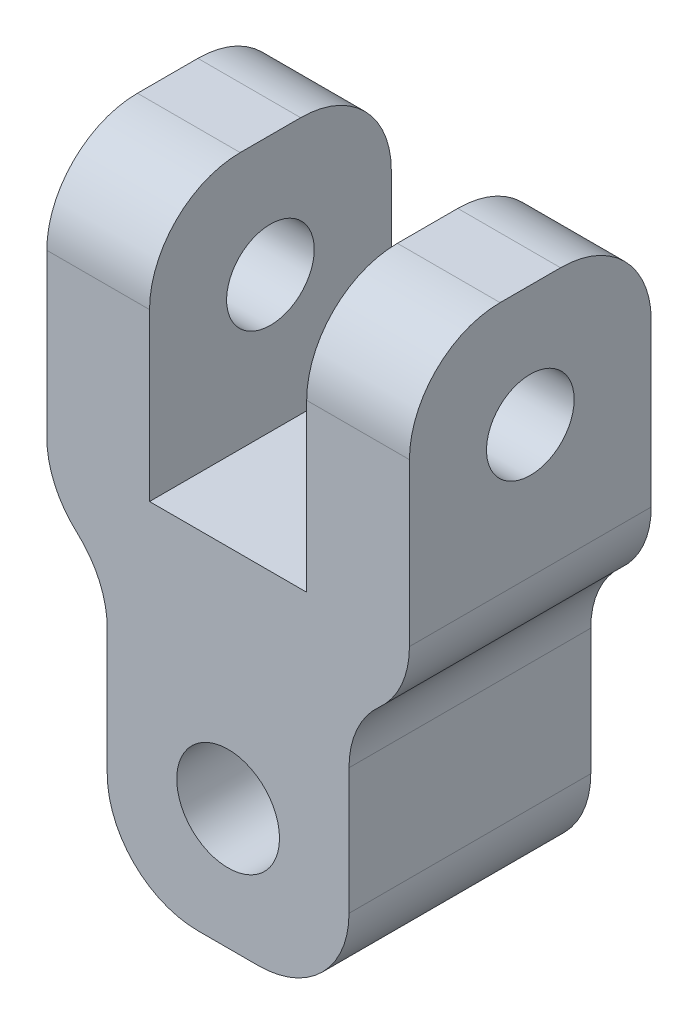
ISO-10303-21;
HEADER;
FILE_DESCRIPTION(('STEP AP214'),'2;1');
FILE_NAME('part.step','',(''),(''),'','','');
FILE_SCHEMA(('AUTOMOTIVE_DESIGN { 1 0 10303 214 1 1 1 1 }'));
ENDSEC;
DATA;
#1=APPLICATION_CONTEXT('core data for automotive mechanical design processes');
#2=APPLICATION_PROTOCOL_DEFINITION('international standard','automotive_design',2000,#1);
#3=PRODUCT_CONTEXT('',#1,'mechanical');
#4=PRODUCT('Part','Part','',(#3));
#5=PRODUCT_RELATED_PRODUCT_CATEGORY('part','',(#4));
#6=PRODUCT_DEFINITION_FORMATION('','',#4);
#7=PRODUCT_DEFINITION_CONTEXT('part definition',#1,'design');
#8=PRODUCT_DEFINITION('design','',#6,#7);
#9=PRODUCT_DEFINITION_SHAPE('','',#8);
#10=(LENGTH_UNIT() NAMED_UNIT(*) SI_UNIT(.MILLI.,.METRE.));
#11=(NAMED_UNIT(*) PLANE_ANGLE_UNIT() SI_UNIT($,.RADIAN.));
#12=(NAMED_UNIT(*) SI_UNIT($,.STERADIAN.) SOLID_ANGLE_UNIT());
#13=UNCERTAINTY_MEASURE_WITH_UNIT(LENGTH_MEASURE(1.E-05),#10,'distance_accuracy_value','');
#14=(GEOMETRIC_REPRESENTATION_CONTEXT(3) GLOBAL_UNCERTAINTY_ASSIGNED_CONTEXT((#13)) GLOBAL_UNIT_ASSIGNED_CONTEXT((#10,
#11,#12)) REPRESENTATION_CONTEXT('',''));
#15=CARTESIAN_POINT('',(0.,0.,0.));
#16=DIRECTION('',(0.,0.,1.));
#17=DIRECTION('',(1.,0.,0.));
#18=AXIS2_PLACEMENT_3D('',#15,#16,#17);
#19=CARTESIAN_POINT('',(0.,20.,0.));
#20=DIRECTION('',(0.,1.,0.));
#21=DIRECTION('',(0.,0.,1.));
#22=AXIS2_PLACEMENT_3D('',#19,#20,#21);
#23=PLANE('',#22);
#24=DIRECTION('',(0.,0.,1.));
#25=VECTOR('',#24,1.);
#26=CARTESIAN_POINT('',(1.4,20.,0.));
#27=LINE('',#26,#25);
#28=CARTESIAN_POINT('',(1.4,20.,3.));
#29=VERTEX_POINT('',#28);
#30=CARTESIAN_POINT('',(1.4,20.,5.));
#31=VERTEX_POINT('',#30);
#32=EDGE_CURVE('E207',#29,#31,#27,.T.);
#33=ORIENTED_EDGE('',*,*,#32,.F.);
#34=DIRECTION('',(-1.,0.,0.));
#35=VECTOR('',#34,1.);
#36=CARTESIAN_POINT('',(-2.,20.,3.));
#37=LINE('',#36,#35);
#38=CARTESIAN_POINT('',(-2.,20.,3.));
#39=VERTEX_POINT('',#38);
#40=EDGE_CURVE('E327',#29,#39,#37,.T.);
#41=ORIENTED_EDGE('',*,*,#40,.T.);
#42=DIRECTION('',(0.,0.,1.));
#43=VECTOR('',#42,1.);
#44=CARTESIAN_POINT('',(-2.,20.,0.));
#45=LINE('',#44,#43);
#46=CARTESIAN_POINT('',(-2.,20.,5.));
#47=VERTEX_POINT('',#46);
#48=EDGE_CURVE('E220',#39,#47,#45,.T.);
#49=ORIENTED_EDGE('',*,*,#48,.T.);
#50=DIRECTION('',(1.,0.,0.));
#51=VECTOR('',#50,1.);
#52=CARTESIAN_POINT('',(1.4,20.,5.));
#53=LINE('',#52,#51);
#54=EDGE_CURVE('E324',#47,#31,#53,.T.);
#55=ORIENTED_EDGE('',*,*,#54,.T.);
#56=EDGE_LOOP('',(#33,#41,#49,#55));
#57=FACE_BOUND('',#56,.T.);
#58=ADVANCED_FACE('F33',(#57),#23,.T.);
#59=CARTESIAN_POINT('',(0.,20.,0.));
#60=DIRECTION('',(1.,0.,0.));
#61=DIRECTION('',(0.,0.,-1.));
#62=AXIS2_PLACEMENT_3D('',#59,#60,#61);
#63=PLANE('',#62);
#64=DIRECTION('',(0.,-1.,0.));
#65=VECTOR('',#64,1.);
#66=CARTESIAN_POINT('',(0.,20.,0.));
#67=LINE('',#66,#65);
#68=CARTESIAN_POINT('',(0.,7.17157287525381,0.));
#69=VERTEX_POINT('',#68);
#70=CARTESIAN_POINT('',(0.,3.,0.));
#71=VERTEX_POINT('',#70);
#72=EDGE_CURVE('E241',#69,#71,#67,.T.);
#73=ORIENTED_EDGE('',*,*,#72,.T.);
#74=DIRECTION('',(0.,0.,1.));
#75=VECTOR('',#74,1.);
#76=CARTESIAN_POINT('',(0.,3.,0.));
#77=LINE('',#76,#75);
#78=CARTESIAN_POINT('',(0.,3.,8.));
#79=VERTEX_POINT('',#78);
#80=EDGE_CURVE('E269',#71,#79,#77,.T.);
#81=ORIENTED_EDGE('',*,*,#80,.T.);
#82=DIRECTION('',(0.,-1.,0.));
#83=VECTOR('',#82,1.);
#84=CARTESIAN_POINT('',(0.,20.,8.));
#85=LINE('',#84,#83);
#86=CARTESIAN_POINT('',(0.,7.17157287525381,8.));
#87=VERTEX_POINT('',#86);
#88=EDGE_CURVE('E250',#87,#79,#85,.T.);
#89=ORIENTED_EDGE('',*,*,#88,.F.);
#90=DIRECTION('',(0.,0.,-1.));
#91=VECTOR('',#90,1.);
#92=CARTESIAN_POINT('',(0.,7.17157287525381,0.));
#93=LINE('',#92,#91);
#94=EDGE_CURVE('E256',#87,#69,#93,.T.);
#95=ORIENTED_EDGE('',*,*,#94,.T.);
#96=EDGE_LOOP('',(#73,#81,#89,#95));
#97=FACE_BOUND('',#96,.T.);
#98=ADVANCED_FACE('F383',(#97),#63,.F.);
#99=CARTESIAN_POINT('',(0.,20.,8.));
#100=DIRECTION('',(0.,0.,-1.));
#101=DIRECTION('',(-1.,0.,0.));
#102=AXIS2_PLACEMENT_3D('',#99,#100,#101);
#103=PLANE('',#102);
#104=CARTESIAN_POINT('',(4.,4.,8.));
#105=DIRECTION('',(0.,0.,1.));
#106=DIRECTION('',(1.,0.,0.));
#107=AXIS2_PLACEMENT_3D('',#104,#105,#106);
#108=CIRCLE('',#107,1.7);
#109=CARTESIAN_POINT('',(5.7,4.,8.));
#110=VERTEX_POINT('',#109);
#111=EDGE_CURVE('E229',#110,#110,#108,.T.);
#112=ORIENTED_EDGE('',*,*,#111,.F.);
#113=EDGE_LOOP('',(#112));
#114=FACE_BOUND('',#113,.T.);
#115=ORIENTED_EDGE('',*,*,#88,.T.);
#116=CARTESIAN_POINT('',(3.,3.,8.));
#117=DIRECTION('',(0.,0.,-1.));
#118=DIRECTION('',(-1.,0.,0.));
#119=AXIS2_PLACEMENT_3D('',#116,#117,#118);
#120=CIRCLE('',#119,3.);
#121=CARTESIAN_POINT('',(3.,0.,8.));
#122=VERTEX_POINT('',#121);
#123=EDGE_CURVE('E286',#79,#122,#120,.F.);
#124=ORIENTED_EDGE('',*,*,#123,.T.);
#125=DIRECTION('',(1.,0.,0.));
#126=VECTOR('',#125,1.);
#127=CARTESIAN_POINT('',(0.,0.,8.));
#128=LINE('',#127,#126);
#129=CARTESIAN_POINT('',(5.,0.,8.));
#130=VERTEX_POINT('',#129);
#131=EDGE_CURVE('E234',#122,#130,#128,.T.);
#132=ORIENTED_EDGE('',*,*,#131,.T.);
#133=CARTESIAN_POINT('',(5.,3.,8.));
#134=DIRECTION('',(0.,0.,-1.));
#135=DIRECTION('',(-1.,0.,0.));
#136=AXIS2_PLACEMENT_3D('',#133,#134,#135);
#137=CIRCLE('',#136,3.);
#138=CARTESIAN_POINT('',(8.,3.,8.));
#139=VERTEX_POINT('',#138);
#140=EDGE_CURVE('E284',#130,#139,#137,.F.);
#141=ORIENTED_EDGE('',*,*,#140,.T.);
#142=DIRECTION('',(0.,-1.,0.));
#143=VECTOR('',#142,1.);
#144=CARTESIAN_POINT('',(8.,20.,8.));
#145=LINE('',#144,#143);
#146=CARTESIAN_POINT('',(8.,7.17157287525381,8.));
#147=VERTEX_POINT('',#146);
#148=EDGE_CURVE('E247',#147,#139,#145,.T.);
#149=ORIENTED_EDGE('',*,*,#148,.F.);
#150=CARTESIAN_POINT('',(11.,7.17157287525381,8.));
#151=DIRECTION('',(0.,0.,-1.));
#152=DIRECTION('',(-1.,0.,0.));
#153=AXIS2_PLACEMENT_3D('',#150,#151,#152);
#154=CIRCLE('',#153,3.);
#155=CARTESIAN_POINT('',(9.,9.4076408527536,8.));
#156=VERTEX_POINT('',#155);
#157=EDGE_CURVE('E259',#147,#156,#154,.T.);
#158=ORIENTED_EDGE('',*,*,#157,.T.);
#159=CARTESIAN_POINT('',(7.,11.6437088302534,8.));
#160=DIRECTION('',(0.,0.,-1.));
#161=DIRECTION('',(-1.,0.,0.));
#162=AXIS2_PLACEMENT_3D('',#159,#160,#161);
#163=CIRCLE('',#162,3.);
#164=CARTESIAN_POINT('',(10.,11.6437088302534,8.));
#165=VERTEX_POINT('',#164);
#166=EDGE_CURVE('E280',#156,#165,#163,.F.);
#167=ORIENTED_EDGE('',*,*,#166,.T.);
#168=DIRECTION('',(0.,1.,0.));
#169=VECTOR('',#168,1.);
#170=CARTESIAN_POINT('',(10.,10.,8.));
#171=LINE('',#170,#169);
#172=CARTESIAN_POINT('',(10.,17.,8.));
#173=VERTEX_POINT('',#172);
#174=EDGE_CURVE('E216',#165,#173,#171,.T.);
#175=ORIENTED_EDGE('',*,*,#174,.T.);
#176=DIRECTION('',(1.,0.,0.));
#177=VECTOR('',#176,1.);
#178=CARTESIAN_POINT('',(6.6,17.,8.));
#179=LINE('',#178,#177);
#180=CARTESIAN_POINT('',(6.6,17.,8.));
#181=VERTEX_POINT('',#180);
#182=EDGE_CURVE('E276',#173,#181,#179,.F.);
#183=ORIENTED_EDGE('',*,*,#182,.T.);
#184=DIRECTION('',(0.,1.,0.));
#185=VECTOR('',#184,1.);
#186=CARTESIAN_POINT('',(6.6,20.,8.));
#187=LINE('',#186,#185);
#188=CARTESIAN_POINT('',(6.6,11.5,8.));
#189=VERTEX_POINT('',#188);
#190=EDGE_CURVE('E183',#189,#181,#187,.T.);
#191=ORIENTED_EDGE('',*,*,#190,.F.);
#192=DIRECTION('',(1.,0.,0.));
#193=VECTOR('',#192,1.);
#194=CARTESIAN_POINT('',(1.4,11.5,8.));
#195=LINE('',#194,#193);
#196=CARTESIAN_POINT('',(1.4,11.5,8.));
#197=VERTEX_POINT('',#196);
#198=EDGE_CURVE('E203',#197,#189,#195,.T.);
#199=ORIENTED_EDGE('',*,*,#198,.F.);
#200=DIRECTION('',(0.,-1.,0.));
#201=VECTOR('',#200,1.);
#202=CARTESIAN_POINT('',(1.4,20.,8.));
#203=LINE('',#202,#201);
#204=CARTESIAN_POINT('',(1.4,17.,8.));
#205=VERTEX_POINT('',#204);
#206=EDGE_CURVE('E189',#205,#197,#203,.T.);
#207=ORIENTED_EDGE('',*,*,#206,.F.);
#208=DIRECTION('',(1.,0.,0.));
#209=VECTOR('',#208,1.);
#210=CARTESIAN_POINT('',(-2.,17.,8.));
#211=LINE('',#210,#209);
#212=CARTESIAN_POINT('',(-2.,17.,8.));
#213=VERTEX_POINT('',#212);
#214=EDGE_CURVE('E278',#205,#213,#211,.F.);
#215=ORIENTED_EDGE('',*,*,#214,.T.);
#216=DIRECTION('',(0.,1.,0.));
#217=VECTOR('',#216,1.);
#218=CARTESIAN_POINT('',(-2.,10.,8.));
#219=LINE('',#218,#217);
#220=CARTESIAN_POINT('',(-2.,11.6437088302534,8.));
#221=VERTEX_POINT('',#220);
#222=EDGE_CURVE('E226',#221,#213,#219,.T.);
#223=ORIENTED_EDGE('',*,*,#222,.F.);
#224=CARTESIAN_POINT('',(1.,11.6437088302534,8.));
#225=DIRECTION('',(0.,0.,-1.));
#226=DIRECTION('',(-1.,0.,0.));
#227=AXIS2_PLACEMENT_3D('',#224,#225,#226);
#228=CIRCLE('',#227,3.);
#229=CARTESIAN_POINT('',(-0.999999999999999,9.4076408527536,8.));
#230=VERTEX_POINT('',#229);
#231=EDGE_CURVE('E282',#221,#230,#228,.F.);
#232=ORIENTED_EDGE('',*,*,#231,.T.);
#233=CARTESIAN_POINT('',(-3.,7.17157287525381,8.));
#234=DIRECTION('',(0.,0.,-1.));
#235=DIRECTION('',(-1.,0.,0.));
#236=AXIS2_PLACEMENT_3D('',#233,#234,#235);
#237=CIRCLE('',#236,3.);
#238=EDGE_CURVE('E267',#230,#87,#237,.T.);
#239=ORIENTED_EDGE('',*,*,#238,.T.);
#240=EDGE_LOOP('',(#115,#124,#132,#141,#149,#158,#167,#175,#183,#191,#199,#207,#215,#223,#232,#239));
#241=FACE_BOUND('',#240,.T.);
#242=ADVANCED_FACE('F353',(#114,#241),#103,.F.);
#243=CARTESIAN_POINT('',(8.,20.,0.));
#244=DIRECTION('',(-1.,0.,0.));
#245=DIRECTION('',(0.,0.,1.));
#246=AXIS2_PLACEMENT_3D('',#243,#244,#245);
#247=PLANE('',#246);
#248=ORIENTED_EDGE('',*,*,#148,.T.);
#249=DIRECTION('',(0.,0.,-1.));
#250=VECTOR('',#249,1.);
#251=CARTESIAN_POINT('',(8.,3.,0.));
#252=LINE('',#251,#250);
#253=CARTESIAN_POINT('',(8.,3.,0.));
#254=VERTEX_POINT('',#253);
#255=EDGE_CURVE('E303',#139,#254,#252,.T.);
#256=ORIENTED_EDGE('',*,*,#255,.T.);
#257=DIRECTION('',(0.,-1.,0.));
#258=VECTOR('',#257,1.);
#259=CARTESIAN_POINT('',(8.,20.,0.));
#260=LINE('',#259,#258);
#261=CARTESIAN_POINT('',(8.,7.17157287525381,0.));
#262=VERTEX_POINT('',#261);
#263=EDGE_CURVE('E244',#262,#254,#260,.T.);
#264=ORIENTED_EDGE('',*,*,#263,.F.);
#265=DIRECTION('',(0.,0.,-1.));
#266=VECTOR('',#265,1.);
#267=CARTESIAN_POINT('',(8.,7.17157287525381,0.));
#268=LINE('',#267,#266);
#269=EDGE_CURVE('E253',#262,#147,#268,.F.);
#270=ORIENTED_EDGE('',*,*,#269,.T.);
#271=EDGE_LOOP('',(#248,#256,#264,#270));
#272=FACE_BOUND('',#271,.T.);
#273=ADVANCED_FACE('F366',(#272),#247,.F.);
#274=CARTESIAN_POINT('',(0.,20.,0.));
#275=DIRECTION('',(0.,0.,1.));
#276=DIRECTION('',(1.,0.,0.));
#277=AXIS2_PLACEMENT_3D('',#274,#275,#276);
#278=PLANE('',#277);
#279=DIRECTION('',(-1.,0.,0.));
#280=VECTOR('',#279,1.);
#281=CARTESIAN_POINT('',(0.,0.,0.));
#282=LINE('',#281,#280);
#283=CARTESIAN_POINT('',(5.,0.,0.));
#284=VERTEX_POINT('',#283);
#285=CARTESIAN_POINT('',(3.,0.,0.));
#286=VERTEX_POINT('',#285);
#287=EDGE_CURVE('E239',#284,#286,#282,.T.);
#288=ORIENTED_EDGE('',*,*,#287,.T.);
#289=CARTESIAN_POINT('',(3.,3.,0.));
#290=DIRECTION('',(0.,0.,1.));
#291=DIRECTION('',(1.,0.,0.));
#292=AXIS2_PLACEMENT_3D('',#289,#290,#291);
#293=CIRCLE('',#292,3.);
#294=EDGE_CURVE('E301',#286,#71,#293,.F.);
#295=ORIENTED_EDGE('',*,*,#294,.T.);
#296=ORIENTED_EDGE('',*,*,#72,.F.);
#297=CARTESIAN_POINT('',(-3.,7.17157287525381,0.));
#298=DIRECTION('',(0.,0.,1.));
#299=DIRECTION('',(1.,0.,0.));
#300=AXIS2_PLACEMENT_3D('',#297,#298,#299);
#301=CIRCLE('',#300,3.);
#302=CARTESIAN_POINT('',(-0.999999999999997,9.4076408527536,0.));
#303=VERTEX_POINT('',#302);
#304=EDGE_CURVE('E264',#69,#303,#301,.T.);
#305=ORIENTED_EDGE('',*,*,#304,.T.);
#306=CARTESIAN_POINT('',(1.,11.6437088302534,0.));
#307=DIRECTION('',(0.,0.,1.));
#308=DIRECTION('',(1.,0.,0.));
#309=AXIS2_PLACEMENT_3D('',#306,#307,#308);
#310=CIRCLE('',#309,3.);
#311=CARTESIAN_POINT('',(-2.,11.6437088302534,0.));
#312=VERTEX_POINT('',#311);
#313=EDGE_CURVE('E297',#303,#312,#310,.F.);
#314=ORIENTED_EDGE('',*,*,#313,.T.);
#315=DIRECTION('',(0.,1.,0.));
#316=VECTOR('',#315,1.);
#317=CARTESIAN_POINT('',(-2.,10.,0.));
#318=LINE('',#317,#316);
#319=CARTESIAN_POINT('',(-2.,17.,0.));
#320=VERTEX_POINT('',#319);
#321=EDGE_CURVE('E225',#312,#320,#318,.T.);
#322=ORIENTED_EDGE('',*,*,#321,.T.);
#323=DIRECTION('',(-1.,0.,0.));
#324=VECTOR('',#323,1.);
#325=CARTESIAN_POINT('',(1.4,17.,0.));
#326=LINE('',#325,#324);
#327=CARTESIAN_POINT('',(1.4,17.,0.));
#328=VERTEX_POINT('',#327);
#329=EDGE_CURVE('E180',#320,#328,#326,.F.);
#330=ORIENTED_EDGE('',*,*,#329,.T.);
#331=DIRECTION('',(0.,-1.,0.));
#332=VECTOR('',#331,1.);
#333=CARTESIAN_POINT('',(1.4,20.,0.));
#334=LINE('',#333,#332);
#335=CARTESIAN_POINT('',(1.4,11.5,0.));
#336=VERTEX_POINT('',#335);
#337=EDGE_CURVE('E170',#328,#336,#334,.T.);
#338=ORIENTED_EDGE('',*,*,#337,.T.);
#339=DIRECTION('',(1.,0.,0.));
#340=VECTOR('',#339,1.);
#341=CARTESIAN_POINT('',(1.4,11.5,0.));
#342=LINE('',#341,#340);
#343=CARTESIAN_POINT('',(6.6,11.5,0.));
#344=VERTEX_POINT('',#343);
#345=EDGE_CURVE('E177',#336,#344,#342,.T.);
#346=ORIENTED_EDGE('',*,*,#345,.T.);
#347=DIRECTION('',(0.,1.,0.));
#348=VECTOR('',#347,1.);
#349=CARTESIAN_POINT('',(6.6,20.,0.));
#350=LINE('',#349,#348);
#351=CARTESIAN_POINT('',(6.6,17.,0.));
#352=VERTEX_POINT('',#351);
#353=EDGE_CURVE('E194',#344,#352,#350,.T.);
#354=ORIENTED_EDGE('',*,*,#353,.T.);
#355=DIRECTION('',(-1.,0.,0.));
#356=VECTOR('',#355,1.);
#357=CARTESIAN_POINT('',(10.,17.,0.));
#358=LINE('',#357,#356);
#359=CARTESIAN_POINT('',(10.,17.,0.));
#360=VERTEX_POINT('',#359);
#361=EDGE_CURVE('E292',#352,#360,#358,.F.);
#362=ORIENTED_EDGE('',*,*,#361,.T.);
#363=DIRECTION('',(0.,1.,0.));
#364=VECTOR('',#363,1.);
#365=CARTESIAN_POINT('',(10.,10.,0.));
#366=LINE('',#365,#364);
#367=CARTESIAN_POINT('',(10.,11.6437088302534,0.));
#368=VERTEX_POINT('',#367);
#369=EDGE_CURVE('E217',#368,#360,#366,.T.);
#370=ORIENTED_EDGE('',*,*,#369,.F.);
#371=CARTESIAN_POINT('',(7.,11.6437088302534,0.));
#372=DIRECTION('',(0.,0.,1.));
#373=DIRECTION('',(1.,0.,0.));
#374=AXIS2_PLACEMENT_3D('',#371,#372,#373);
#375=CIRCLE('',#374,3.);
#376=CARTESIAN_POINT('',(9.,9.4076408527536,0.));
#377=VERTEX_POINT('',#376);
#378=EDGE_CURVE('E295',#368,#377,#375,.F.);
#379=ORIENTED_EDGE('',*,*,#378,.T.);
#380=CARTESIAN_POINT('',(11.,7.17157287525381,0.));
#381=DIRECTION('',(0.,0.,1.));
#382=DIRECTION('',(1.,0.,0.));
#383=AXIS2_PLACEMENT_3D('',#380,#381,#382);
#384=CIRCLE('',#383,3.);
#385=EDGE_CURVE('E262',#377,#262,#384,.T.);
#386=ORIENTED_EDGE('',*,*,#385,.T.);
#387=ORIENTED_EDGE('',*,*,#263,.T.);
#388=CARTESIAN_POINT('',(5.,3.,0.));
#389=DIRECTION('',(0.,0.,1.));
#390=DIRECTION('',(1.,0.,0.));
#391=AXIS2_PLACEMENT_3D('',#388,#389,#390);
#392=CIRCLE('',#391,3.);
#393=EDGE_CURVE('E299',#254,#284,#392,.F.);
#394=ORIENTED_EDGE('',*,*,#393,.T.);
#395=EDGE_LOOP('',(#288,#295,#296,#305,#314,#322,#330,#338,#346,#354,#362,#370,#379,#386,#387,#394));
#396=FACE_BOUND('',#395,.T.);
#397=CARTESIAN_POINT('',(4.,4.,0.));
#398=DIRECTION('',(0.,0.,1.));
#399=DIRECTION('',(1.,0.,0.));
#400=AXIS2_PLACEMENT_3D('',#397,#398,#399);
#401=CIRCLE('',#400,1.7);
#402=CARTESIAN_POINT('',(5.7,4.,0.));
#403=VERTEX_POINT('',#402);
#404=EDGE_CURVE('E231',#403,#403,#401,.T.);
#405=ORIENTED_EDGE('',*,*,#404,.T.);
#406=EDGE_LOOP('',(#405));
#407=FACE_BOUND('',#406,.T.);
#408=ADVANCED_FACE('F173',(#396,#407),#278,.F.);
#409=DIRECTION('',(0.,0.,1.));
#410=VECTOR('',#409,1.);
#411=CARTESIAN_POINT('',(6.6,20.,0.));
#412=LINE('',#411,#410);
#413=CARTESIAN_POINT('',(6.6,20.,3.));
#414=VERTEX_POINT('',#413);
#415=CARTESIAN_POINT('',(6.6,20.,5.));
#416=VERTEX_POINT('',#415);
#417=EDGE_CURVE('E211',#414,#416,#412,.T.);
#418=ORIENTED_EDGE('',*,*,#417,.T.);
#419=DIRECTION('',(1.,0.,0.));
#420=VECTOR('',#419,1.);
#421=CARTESIAN_POINT('',(10.,20.,5.));
#422=LINE('',#421,#420);
#423=CARTESIAN_POINT('',(10.,20.,5.));
#424=VERTEX_POINT('',#423);
#425=EDGE_CURVE('E336',#416,#424,#422,.T.);
#426=ORIENTED_EDGE('',*,*,#425,.T.);
#427=DIRECTION('',(0.,0.,-1.));
#428=VECTOR('',#427,1.);
#429=CARTESIAN_POINT('',(10.,20.,0.));
#430=LINE('',#429,#428);
#431=CARTESIAN_POINT('',(10.,20.,3.));
#432=VERTEX_POINT('',#431);
#433=EDGE_CURVE('E210',#424,#432,#430,.T.);
#434=ORIENTED_EDGE('',*,*,#433,.T.);
#435=DIRECTION('',(-1.,0.,0.));
#436=VECTOR('',#435,1.);
#437=CARTESIAN_POINT('',(6.6,20.,3.));
#438=LINE('',#437,#436);
#439=EDGE_CURVE('E334',#432,#414,#438,.T.);
#440=ORIENTED_EDGE('',*,*,#439,.T.);
#441=EDGE_LOOP('',(#418,#426,#434,#440));
#442=FACE_BOUND('',#441,.T.);
#443=ADVANCED_FACE('F346',(#442),#23,.T.);
#444=CARTESIAN_POINT('',(0.,0.,0.));
#445=DIRECTION('',(0.,1.,0.));
#446=DIRECTION('',(0.,0.,1.));
#447=AXIS2_PLACEMENT_3D('',#444,#445,#446);
#448=PLANE('',#447);
#449=ORIENTED_EDGE('',*,*,#131,.F.);
#450=DIRECTION('',(0.,0.,1.));
#451=VECTOR('',#450,1.);
#452=CARTESIAN_POINT('',(3.,0.,0.));
#453=LINE('',#452,#451);
#454=EDGE_CURVE('E290',#122,#286,#453,.F.);
#455=ORIENTED_EDGE('',*,*,#454,.T.);
#456=ORIENTED_EDGE('',*,*,#287,.F.);
#457=DIRECTION('',(0.,0.,-1.));
#458=VECTOR('',#457,1.);
#459=CARTESIAN_POINT('',(5.,0.,0.));
#460=LINE('',#459,#458);
#461=EDGE_CURVE('E288',#284,#130,#460,.F.);
#462=ORIENTED_EDGE('',*,*,#461,.T.);
#463=EDGE_LOOP('',(#449,#455,#456,#462));
#464=FACE_BOUND('',#463,.T.);
#465=ADVANCED_FACE('F376',(#464),#448,.F.);
#466=CARTESIAN_POINT('',(4.,4.,0.));
#467=DIRECTION('',(0.,0.,1.));
#468=DIRECTION('',(1.,0.,0.));
#469=AXIS2_PLACEMENT_3D('',#466,#467,#468);
#470=CYLINDRICAL_SURFACE('',#469,1.7);
#471=ORIENTED_EDGE('',*,*,#404,.F.);
#472=EDGE_LOOP('',(#471));
#473=FACE_BOUND('',#472,.T.);
#474=ORIENTED_EDGE('',*,*,#111,.T.);
#475=EDGE_LOOP('',(#474));
#476=FACE_BOUND('',#475,.T.);
#477=ADVANCED_FACE('F430',(#473,#476),#470,.F.);
#478=CARTESIAN_POINT('',(-2.,10.,0.));
#479=DIRECTION('',(-1.,0.,0.));
#480=DIRECTION('',(0.,0.,1.));
#481=AXIS2_PLACEMENT_3D('',#478,#479,#480);
#482=PLANE('',#481);
#483=CARTESIAN_POINT('',(-2.,16.,4.));
#484=DIRECTION('',(1.,0.,0.));
#485=DIRECTION('',(0.,0.,-1.));
#486=AXIS2_PLACEMENT_3D('',#483,#484,#485);
#487=CIRCLE('',#486,1.45);
#488=CARTESIAN_POINT('',(-2.,16.,2.55));
#489=VERTEX_POINT('',#488);
#490=EDGE_CURVE('E273',#489,#489,#487,.T.);
#491=ORIENTED_EDGE('',*,*,#490,.T.);
#492=EDGE_LOOP('',(#491));
#493=FACE_BOUND('',#492,.T.);
#494=ORIENTED_EDGE('',*,*,#321,.F.);
#495=DIRECTION('',(0.,0.,1.));
#496=VECTOR('',#495,1.);
#497=CARTESIAN_POINT('',(-2.,11.6437088302534,8.));
#498=LINE('',#497,#496);
#499=EDGE_CURVE('E310',#312,#221,#498,.T.);
#500=ORIENTED_EDGE('',*,*,#499,.T.);
#501=ORIENTED_EDGE('',*,*,#222,.T.);
#502=CARTESIAN_POINT('',(-2.,17.,5.));
#503=DIRECTION('',(-1.,0.,0.));
#504=DIRECTION('',(0.,0.,1.));
#505=AXIS2_PLACEMENT_3D('',#502,#503,#504);
#506=CIRCLE('',#505,3.);
#507=EDGE_CURVE('E306',#213,#47,#506,.T.);
#508=ORIENTED_EDGE('',*,*,#507,.T.);
#509=ORIENTED_EDGE('',*,*,#48,.F.);
#510=CARTESIAN_POINT('',(-2.,17.,3.));
#511=DIRECTION('',(-1.,0.,0.));
#512=DIRECTION('',(0.,0.,1.));
#513=AXIS2_PLACEMENT_3D('',#510,#511,#512);
#514=CIRCLE('',#513,3.);
#515=EDGE_CURVE('E308',#39,#320,#514,.T.);
#516=ORIENTED_EDGE('',*,*,#515,.T.);
#517=EDGE_LOOP('',(#494,#500,#501,#508,#509,#516));
#518=FACE_BOUND('',#517,.T.);
#519=ADVANCED_FACE('F397',(#493,#518),#482,.T.);
#520=CARTESIAN_POINT('',(10.,10.,0.));
#521=DIRECTION('',(1.,0.,0.));
#522=DIRECTION('',(0.,0.,-1.));
#523=AXIS2_PLACEMENT_3D('',#520,#521,#522);
#524=PLANE('',#523);
#525=CARTESIAN_POINT('',(10.,16.,4.));
#526=DIRECTION('',(1.,0.,0.));
#527=DIRECTION('',(0.,0.,-1.));
#528=AXIS2_PLACEMENT_3D('',#525,#526,#527);
#529=CIRCLE('',#528,1.45);
#530=CARTESIAN_POINT('',(10.,16.,2.55));
#531=VERTEX_POINT('',#530);
#532=EDGE_CURVE('E637',#531,#531,#529,.T.);
#533=ORIENTED_EDGE('',*,*,#532,.F.);
#534=EDGE_LOOP('',(#533));
#535=FACE_BOUND('',#534,.T.);
#536=ORIENTED_EDGE('',*,*,#174,.F.);
#537=DIRECTION('',(0.,0.,1.));
#538=VECTOR('',#537,1.);
#539=CARTESIAN_POINT('',(10.,11.6437088302534,0.));
#540=LINE('',#539,#538);
#541=EDGE_CURVE('E319',#165,#368,#540,.F.);
#542=ORIENTED_EDGE('',*,*,#541,.T.);
#543=ORIENTED_EDGE('',*,*,#369,.T.);
#544=CARTESIAN_POINT('',(10.,17.,3.));
#545=DIRECTION('',(1.,0.,0.));
#546=DIRECTION('',(0.,0.,-1.));
#547=AXIS2_PLACEMENT_3D('',#544,#545,#546);
#548=CIRCLE('',#547,3.);
#549=EDGE_CURVE('E315',#360,#432,#548,.T.);
#550=ORIENTED_EDGE('',*,*,#549,.T.);
#551=ORIENTED_EDGE('',*,*,#433,.F.);
#552=CARTESIAN_POINT('',(10.,17.,5.));
#553=DIRECTION('',(1.,0.,0.));
#554=DIRECTION('',(0.,0.,-1.));
#555=AXIS2_PLACEMENT_3D('',#552,#553,#554);
#556=CIRCLE('',#555,3.);
#557=EDGE_CURVE('E317',#424,#173,#556,.T.);
#558=ORIENTED_EDGE('',*,*,#557,.T.);
#559=EDGE_LOOP('',(#536,#542,#543,#550,#551,#558));
#560=FACE_BOUND('',#559,.T.);
#561=ADVANCED_FACE('F344',(#535,#560),#524,.T.);
#562=CARTESIAN_POINT('',(1.4,20.,0.));
#563=DIRECTION('',(-1.,0.,0.));
#564=DIRECTION('',(0.,-1.,0.));
#565=AXIS2_PLACEMENT_3D('',#562,#563,#564);
#566=PLANE('',#565);
#567=CARTESIAN_POINT('',(1.4,16.,4.));
#568=DIRECTION('',(-1.,0.,0.));
#569=DIRECTION('',(0.,-1.,0.));
#570=AXIS2_PLACEMENT_3D('',#567,#568,#569);
#571=CIRCLE('',#570,1.45);
#572=CARTESIAN_POINT('',(1.4,14.55,4.));
#573=VERTEX_POINT('',#572);
#574=EDGE_CURVE('E204',#573,#573,#571,.T.);
#575=ORIENTED_EDGE('',*,*,#574,.T.);
#576=EDGE_LOOP('',(#575));
#577=FACE_BOUND('',#576,.T.);
#578=ORIENTED_EDGE('',*,*,#337,.F.);
#579=CARTESIAN_POINT('',(1.4,17.,3.));
#580=DIRECTION('',(-1.,0.,0.));
#581=DIRECTION('',(0.,-1.,0.));
#582=AXIS2_PLACEMENT_3D('',#579,#580,#581);
#583=CIRCLE('',#582,3.);
#584=EDGE_CURVE('E332',#328,#29,#583,.F.);
#585=ORIENTED_EDGE('',*,*,#584,.T.);
#586=ORIENTED_EDGE('',*,*,#32,.T.);
#587=CARTESIAN_POINT('',(1.4,17.,5.));
#588=DIRECTION('',(-1.,0.,0.));
#589=DIRECTION('',(0.,-1.,0.));
#590=AXIS2_PLACEMENT_3D('',#587,#588,#589);
#591=CIRCLE('',#590,3.);
#592=EDGE_CURVE('E330',#31,#205,#591,.F.);
#593=ORIENTED_EDGE('',*,*,#592,.T.);
#594=ORIENTED_EDGE('',*,*,#206,.T.);
#595=DIRECTION('',(0.,0.,1.));
#596=VECTOR('',#595,1.);
#597=CARTESIAN_POINT('',(1.4,11.5,0.));
#598=LINE('',#597,#596);
#599=EDGE_CURVE('E186',#336,#197,#598,.T.);
#600=ORIENTED_EDGE('',*,*,#599,.F.);
#601=EDGE_LOOP('',(#578,#585,#586,#593,#594,#600));
#602=FACE_BOUND('',#601,.T.);
#603=ADVANCED_FACE('F187',(#577,#602),#566,.F.);
#604=CARTESIAN_POINT('',(6.6,20.,0.));
#605=DIRECTION('',(1.,0.,0.));
#606=DIRECTION('',(0.,1.,0.));
#607=AXIS2_PLACEMENT_3D('',#604,#605,#606);
#608=PLANE('',#607);
#609=CARTESIAN_POINT('',(6.6,16.,4.));
#610=DIRECTION('',(1.,0.,0.));
#611=DIRECTION('',(0.,1.,0.));
#612=AXIS2_PLACEMENT_3D('',#609,#610,#611);
#613=CIRCLE('',#612,1.45);
#614=CARTESIAN_POINT('',(6.6,17.45,4.));
#615=VERTEX_POINT('',#614);
#616=EDGE_CURVE('E270',#615,#615,#613,.T.);
#617=ORIENTED_EDGE('',*,*,#616,.T.);
#618=EDGE_LOOP('',(#617));
#619=FACE_BOUND('',#618,.T.);
#620=ORIENTED_EDGE('',*,*,#190,.T.);
#621=CARTESIAN_POINT('',(6.6,17.,5.));
#622=DIRECTION('',(1.,0.,0.));
#623=DIRECTION('',(0.,1.,0.));
#624=AXIS2_PLACEMENT_3D('',#621,#622,#623);
#625=CIRCLE('',#624,3.);
#626=EDGE_CURVE('E11',#181,#416,#625,.F.);
#627=ORIENTED_EDGE('',*,*,#626,.T.);
#628=ORIENTED_EDGE('',*,*,#417,.F.);
#629=CARTESIAN_POINT('',(6.6,17.,3.));
#630=DIRECTION('',(1.,0.,0.));
#631=DIRECTION('',(0.,1.,0.));
#632=AXIS2_PLACEMENT_3D('',#629,#630,#631);
#633=CIRCLE('',#632,3.);
#634=EDGE_CURVE('E41',#414,#352,#633,.F.);
#635=ORIENTED_EDGE('',*,*,#634,.T.);
#636=ORIENTED_EDGE('',*,*,#353,.F.);
#637=DIRECTION('',(0.,0.,1.));
#638=VECTOR('',#637,1.);
#639=CARTESIAN_POINT('',(6.6,11.5,0.));
#640=LINE('',#639,#638);
#641=EDGE_CURVE('E193',#344,#189,#640,.T.);
#642=ORIENTED_EDGE('',*,*,#641,.T.);
#643=EDGE_LOOP('',(#620,#627,#628,#635,#636,#642));
#644=FACE_BOUND('',#643,.T.);
#645=ADVANCED_FACE('F338',(#619,#644),#608,.F.);
#646=CARTESIAN_POINT('',(1.4,11.5,0.));
#647=DIRECTION('',(0.,-1.,0.));
#648=DIRECTION('',(0.,0.,-1.));
#649=AXIS2_PLACEMENT_3D('',#646,#647,#648);
#650=PLANE('',#649);
#651=ORIENTED_EDGE('',*,*,#198,.T.);
#652=ORIENTED_EDGE('',*,*,#641,.F.);
#653=ORIENTED_EDGE('',*,*,#345,.F.);
#654=ORIENTED_EDGE('',*,*,#599,.T.);
#655=EDGE_LOOP('',(#651,#652,#653,#654));
#656=FACE_BOUND('',#655,.T.);
#657=ADVANCED_FACE('F196',(#656),#650,.F.);
#658=CARTESIAN_POINT('',(11.,7.17157287525381,0.));
#659=DIRECTION('',(0.,0.,-1.));
#660=DIRECTION('',(-1.,0.,0.));
#661=AXIS2_PLACEMENT_3D('',#658,#659,#660);
#662=CYLINDRICAL_SURFACE('',#661,3.);
#663=ORIENTED_EDGE('',*,*,#385,.F.);
#664=DIRECTION('',(0.,0.,-1.));
#665=VECTOR('',#664,1.);
#666=CARTESIAN_POINT('',(9.,9.4076408527536,0.));
#667=LINE('',#666,#665);
#668=EDGE_CURVE('E322',#377,#156,#667,.F.);
#669=ORIENTED_EDGE('',*,*,#668,.T.);
#670=ORIENTED_EDGE('',*,*,#157,.F.);
#671=ORIENTED_EDGE('',*,*,#269,.F.);
#672=EDGE_LOOP('',(#663,#669,#670,#671));
#673=FACE_BOUND('',#672,.T.);
#674=ADVANCED_FACE('F364',(#673),#662,.F.);
#675=CARTESIAN_POINT('',(-3.,7.17157287525381,0.));
#676=DIRECTION('',(0.,0.,-1.));
#677=DIRECTION('',(-1.,0.,0.));
#678=AXIS2_PLACEMENT_3D('',#675,#676,#677);
#679=CYLINDRICAL_SURFACE('',#678,3.);
#680=ORIENTED_EDGE('',*,*,#238,.F.);
#681=DIRECTION('',(0.,0.,-1.));
#682=VECTOR('',#681,1.);
#683=CARTESIAN_POINT('',(-0.999999999999998,9.4076408527536,0.));
#684=LINE('',#683,#682);
#685=EDGE_CURVE('E313',#230,#303,#684,.T.);
#686=ORIENTED_EDGE('',*,*,#685,.T.);
#687=ORIENTED_EDGE('',*,*,#304,.F.);
#688=ORIENTED_EDGE('',*,*,#94,.F.);
#689=EDGE_LOOP('',(#680,#686,#687,#688));
#690=FACE_BOUND('',#689,.T.);
#691=ADVANCED_FACE('F388',(#690),#679,.F.);
#692=CARTESIAN_POINT('',(-2.,16.,4.));
#693=DIRECTION('',(1.,0.,0.));
#694=DIRECTION('',(0.,0.,-1.));
#695=AXIS2_PLACEMENT_3D('',#692,#693,#694);
#696=CYLINDRICAL_SURFACE('',#695,1.45);
#697=ORIENTED_EDGE('',*,*,#532,.T.);
#698=EDGE_LOOP('',(#697));
#699=FACE_BOUND('',#698,.T.);
#700=ORIENTED_EDGE('',*,*,#616,.F.);
#701=EDGE_LOOP('',(#700));
#702=FACE_BOUND('',#701,.T.);
#703=ADVANCED_FACE('F444',(#699,#702),#696,.F.);
#704=ORIENTED_EDGE('',*,*,#490,.F.);
#705=EDGE_LOOP('',(#704));
#706=FACE_BOUND('',#705,.T.);
#707=ORIENTED_EDGE('',*,*,#574,.F.);
#708=EDGE_LOOP('',(#707));
#709=FACE_BOUND('',#708,.T.);
#710=ADVANCED_FACE('F447',(#706,#709),#696,.F.);
#711=CARTESIAN_POINT('',(3.,3.,0.));
#712=DIRECTION('',(0.,0.,1.));
#713=DIRECTION('',(1.,0.,0.));
#714=AXIS2_PLACEMENT_3D('',#711,#712,#713);
#715=CYLINDRICAL_SURFACE('',#714,3.);
#716=ORIENTED_EDGE('',*,*,#294,.F.);
#717=ORIENTED_EDGE('',*,*,#454,.F.);
#718=ORIENTED_EDGE('',*,*,#123,.F.);
#719=ORIENTED_EDGE('',*,*,#80,.F.);
#720=EDGE_LOOP('',(#716,#717,#718,#719));
#721=FACE_BOUND('',#720,.T.);
#722=ADVANCED_FACE('F379',(#721),#715,.T.);
#723=CARTESIAN_POINT('',(5.,3.,0.));
#724=DIRECTION('',(0.,0.,-1.));
#725=DIRECTION('',(-1.,0.,0.));
#726=AXIS2_PLACEMENT_3D('',#723,#724,#725);
#727=CYLINDRICAL_SURFACE('',#726,3.);
#728=ORIENTED_EDGE('',*,*,#140,.F.);
#729=ORIENTED_EDGE('',*,*,#461,.F.);
#730=ORIENTED_EDGE('',*,*,#393,.F.);
#731=ORIENTED_EDGE('',*,*,#255,.F.);
#732=EDGE_LOOP('',(#728,#729,#730,#731));
#733=FACE_BOUND('',#732,.T.);
#734=ADVANCED_FACE('F372',(#733),#727,.T.);
#735=CARTESIAN_POINT('',(1.,11.6437088302534,0.));
#736=DIRECTION('',(0.,0.,-1.));
#737=DIRECTION('',(-1.,0.,0.));
#738=AXIS2_PLACEMENT_3D('',#735,#736,#737);
#739=CYLINDRICAL_SURFACE('',#738,3.);
#740=ORIENTED_EDGE('',*,*,#313,.F.);
#741=ORIENTED_EDGE('',*,*,#685,.F.);
#742=ORIENTED_EDGE('',*,*,#231,.F.);
#743=ORIENTED_EDGE('',*,*,#499,.F.);
#744=EDGE_LOOP('',(#740,#741,#742,#743));
#745=FACE_BOUND('',#744,.T.);
#746=ADVANCED_FACE('F394',(#745),#739,.T.);
#747=CARTESIAN_POINT('',(7.,11.6437088302534,0.));
#748=DIRECTION('',(0.,0.,-1.));
#749=DIRECTION('',(-1.,0.,0.));
#750=AXIS2_PLACEMENT_3D('',#747,#748,#749);
#751=CYLINDRICAL_SURFACE('',#750,3.);
#752=ORIENTED_EDGE('',*,*,#166,.F.);
#753=ORIENTED_EDGE('',*,*,#668,.F.);
#754=ORIENTED_EDGE('',*,*,#378,.F.);
#755=ORIENTED_EDGE('',*,*,#541,.F.);
#756=EDGE_LOOP('',(#752,#753,#754,#755));
#757=FACE_BOUND('',#756,.T.);
#758=ADVANCED_FACE('F359',(#757),#751,.T.);
#759=CARTESIAN_POINT('',(0.,17.,3.));
#760=DIRECTION('',(1.,0.,0.));
#761=DIRECTION('',(0.,0.,-1.));
#762=AXIS2_PLACEMENT_3D('',#759,#760,#761);
#763=CYLINDRICAL_SURFACE('',#762,3.);
#764=ORIENTED_EDGE('',*,*,#584,.F.);
#765=ORIENTED_EDGE('',*,*,#329,.F.);
#766=ORIENTED_EDGE('',*,*,#515,.F.);
#767=ORIENTED_EDGE('',*,*,#40,.F.);
#768=EDGE_LOOP('',(#764,#765,#766,#767));
#769=FACE_BOUND('',#768,.T.);
#770=ADVANCED_FACE('F408',(#769),#763,.T.);
#771=CARTESIAN_POINT('',(0.,17.,5.));
#772=DIRECTION('',(-1.,0.,0.));
#773=DIRECTION('',(0.,0.,1.));
#774=AXIS2_PLACEMENT_3D('',#771,#772,#773);
#775=CYLINDRICAL_SURFACE('',#774,3.);
#776=ORIENTED_EDGE('',*,*,#507,.F.);
#777=ORIENTED_EDGE('',*,*,#214,.F.);
#778=ORIENTED_EDGE('',*,*,#592,.F.);
#779=ORIENTED_EDGE('',*,*,#54,.F.);
#780=EDGE_LOOP('',(#776,#777,#778,#779));
#781=FACE_BOUND('',#780,.T.);
#782=ADVANCED_FACE('F401',(#781),#775,.T.);
#783=CARTESIAN_POINT('',(0.,17.,5.));
#784=DIRECTION('',(-1.,0.,0.));
#785=DIRECTION('',(0.,0.,1.));
#786=AXIS2_PLACEMENT_3D('',#783,#784,#785);
#787=CYLINDRICAL_SURFACE('',#786,3.);
#788=ORIENTED_EDGE('',*,*,#626,.F.);
#789=ORIENTED_EDGE('',*,*,#182,.F.);
#790=ORIENTED_EDGE('',*,*,#557,.F.);
#791=ORIENTED_EDGE('',*,*,#425,.F.);
#792=EDGE_LOOP('',(#788,#789,#790,#791));
#793=FACE_BOUND('',#792,.T.);
#794=ADVANCED_FACE('F349',(#793),#787,.T.);
#795=CARTESIAN_POINT('',(0.,17.,3.));
#796=DIRECTION('',(1.,0.,0.));
#797=DIRECTION('',(0.,0.,-1.));
#798=AXIS2_PLACEMENT_3D('',#795,#796,#797);
#799=CYLINDRICAL_SURFACE('',#798,3.);
#800=ORIENTED_EDGE('',*,*,#549,.F.);
#801=ORIENTED_EDGE('',*,*,#361,.F.);
#802=ORIENTED_EDGE('',*,*,#634,.F.);
#803=ORIENTED_EDGE('',*,*,#439,.F.);
#804=EDGE_LOOP('',(#800,#801,#802,#803));
#805=FACE_BOUND('',#804,.T.);
#806=ADVANCED_FACE('F35',(#805),#799,.T.);
#807=CLOSED_SHELL('',(#58,#98,#242,#273,#408,#443,#465,#477,#519,#561,#603,#645,#657,#674,#691,
#703,#710,#722,#734,#746,#758,#770,#782,#794,#806));
#808=MANIFOLD_SOLID_BREP('B2',#807);
#809=ADVANCED_BREP_SHAPE_REPRESENTATION('',(#18,#808),#14);
#810=SHAPE_DEFINITION_REPRESENTATION(#9,#809);
ENDSEC;
END-ISO-10303-21;
